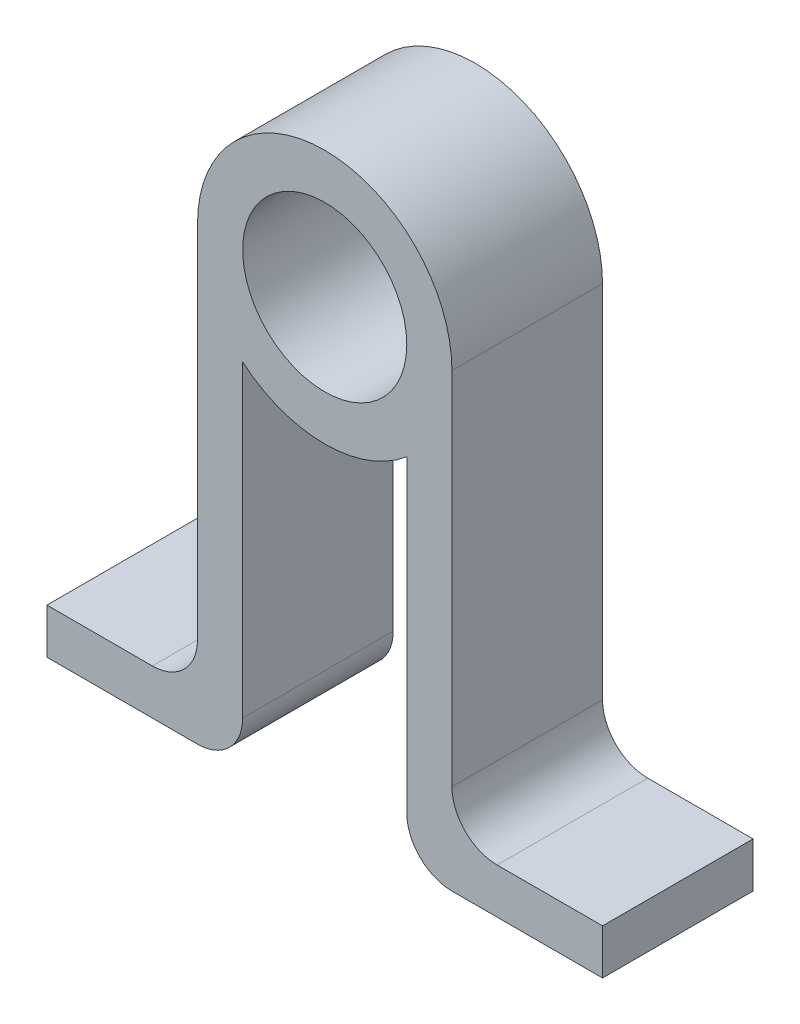
ISO-10303-21;
HEADER;
FILE_DESCRIPTION(('STEP AP214'),'2;1');
FILE_NAME('part.step','',(''),(''),'','','');
FILE_SCHEMA(('AUTOMOTIVE_DESIGN { 1 0 10303 214 1 1 1 1 }'));
ENDSEC;
DATA;
#1=APPLICATION_CONTEXT('core data for automotive mechanical design processes');
#2=APPLICATION_PROTOCOL_DEFINITION('international standard','automotive_design',2000,#1);
#3=PRODUCT_CONTEXT('',#1,'mechanical');
#4=PRODUCT('Part','Part','',(#3));
#5=PRODUCT_RELATED_PRODUCT_CATEGORY('part','',(#4));
#6=PRODUCT_DEFINITION_FORMATION('','',#4);
#7=PRODUCT_DEFINITION_CONTEXT('part definition',#1,'design');
#8=PRODUCT_DEFINITION('design','',#6,#7);
#9=PRODUCT_DEFINITION_SHAPE('','',#8);
#10=(LENGTH_UNIT() NAMED_UNIT(*) SI_UNIT(.MILLI.,.METRE.));
#11=(NAMED_UNIT(*) PLANE_ANGLE_UNIT() SI_UNIT($,.RADIAN.));
#12=(NAMED_UNIT(*) SI_UNIT($,.STERADIAN.) SOLID_ANGLE_UNIT());
#13=UNCERTAINTY_MEASURE_WITH_UNIT(LENGTH_MEASURE(1.E-05),#10,'distance_accuracy_value','');
#14=(GEOMETRIC_REPRESENTATION_CONTEXT(3) GLOBAL_UNCERTAINTY_ASSIGNED_CONTEXT((#13)) GLOBAL_UNIT_ASSIGNED_CONTEXT((#10,
#11,#12)) REPRESENTATION_CONTEXT('',''));
#15=CARTESIAN_POINT('',(0.,0.,0.));
#16=DIRECTION('',(0.,0.,1.));
#17=DIRECTION('',(1.,0.,0.));
#18=AXIS2_PLACEMENT_3D('',#15,#16,#17);
#19=CARTESIAN_POINT('',(-11.45,-23.94,10.));
#20=DIRECTION('',(0.,0.,-1.));
#21=DIRECTION('',(-1.,0.,0.));
#22=AXIS2_PLACEMENT_3D('',#19,#20,#21);
#23=CYLINDRICAL_SURFACE('',#22,3.);
#24=CARTESIAN_POINT('',(-11.45,-23.94,0.));
#25=DIRECTION('',(0.,0.,1.));
#26=DIRECTION('',(1.,0.,0.));
#27=AXIS2_PLACEMENT_3D('',#24,#25,#26);
#28=CIRCLE('',#27,3.);
#29=CARTESIAN_POINT('',(-11.45,-26.94,0.));
#30=VERTEX_POINT('',#29);
#31=CARTESIAN_POINT('',(-8.45,-23.94,0.));
#32=VERTEX_POINT('',#31);
#33=EDGE_CURVE('E205',#30,#32,#28,.T.);
#34=ORIENTED_EDGE('',*,*,#33,.F.);
#35=DIRECTION('',(0.,0.,-1.));
#36=VECTOR('',#35,1.);
#37=CARTESIAN_POINT('',(-11.45,-26.94,10.));
#38=LINE('',#37,#36);
#39=CARTESIAN_POINT('',(-11.45,-26.94,10.));
#40=VERTEX_POINT('',#39);
#41=EDGE_CURVE('E11',#40,#30,#38,.T.);
#42=ORIENTED_EDGE('',*,*,#41,.F.);
#43=CARTESIAN_POINT('',(-11.45,-23.94,10.));
#44=DIRECTION('',(0.,0.,1.));
#45=DIRECTION('',(1.,0.,0.));
#46=AXIS2_PLACEMENT_3D('',#43,#44,#45);
#47=CIRCLE('',#46,3.);
#48=CARTESIAN_POINT('',(-8.45,-23.94,10.));
#49=VERTEX_POINT('',#48);
#50=EDGE_CURVE('E257',#40,#49,#47,.T.);
#51=ORIENTED_EDGE('',*,*,#50,.T.);
#52=DIRECTION('',(0.,0.,-1.));
#53=VECTOR('',#52,1.);
#54=CARTESIAN_POINT('',(-8.45,-23.94,10.));
#55=LINE('',#54,#53);
#56=EDGE_CURVE('E125',#49,#32,#55,.T.);
#57=ORIENTED_EDGE('',*,*,#56,.T.);
#58=EDGE_LOOP('',(#34,#42,#51,#57));
#59=FACE_BOUND('',#58,.T.);
#60=ADVANCED_FACE('F50',(#59),#23,.F.);
#61=CARTESIAN_POINT('',(0.,-26.94,10.));
#62=DIRECTION('',(0.,-1.,0.));
#63=DIRECTION('',(0.,0.,-1.));
#64=AXIS2_PLACEMENT_3D('',#61,#62,#63);
#65=PLANE('',#64);
#66=DIRECTION('',(-1.,0.,0.));
#67=VECTOR('',#66,1.);
#68=CARTESIAN_POINT('',(0.,-26.94,0.));
#69=LINE('',#68,#67);
#70=CARTESIAN_POINT('',(-18.45,-26.94,0.));
#71=VERTEX_POINT('',#70);
#72=EDGE_CURVE('E206',#30,#71,#69,.T.);
#73=ORIENTED_EDGE('',*,*,#72,.T.);
#74=DIRECTION('',(0.,0.,-1.));
#75=VECTOR('',#74,1.);
#76=CARTESIAN_POINT('',(-18.45,-26.94,10.));
#77=LINE('',#76,#75);
#78=CARTESIAN_POINT('',(-18.45,-26.94,10.));
#79=VERTEX_POINT('',#78);
#80=EDGE_CURVE('E57',#79,#71,#77,.T.);
#81=ORIENTED_EDGE('',*,*,#80,.F.);
#82=DIRECTION('',(-1.,0.,0.));
#83=VECTOR('',#82,1.);
#84=CARTESIAN_POINT('',(0.,-26.94,10.));
#85=LINE('',#84,#83);
#86=EDGE_CURVE('E328',#40,#79,#85,.T.);
#87=ORIENTED_EDGE('',*,*,#86,.F.);
#88=ORIENTED_EDGE('',*,*,#41,.T.);
#89=EDGE_LOOP('',(#73,#81,#87,#88));
#90=FACE_BOUND('',#89,.T.);
#91=ADVANCED_FACE('F373',(#90),#65,.F.);
#92=CARTESIAN_POINT('',(-18.45,0.,10.));
#93=DIRECTION('',(1.,0.,0.));
#94=DIRECTION('',(0.,0.,-1.));
#95=AXIS2_PLACEMENT_3D('',#92,#93,#94);
#96=PLANE('',#95);
#97=DIRECTION('',(0.,-1.,0.));
#98=VECTOR('',#97,1.);
#99=CARTESIAN_POINT('',(-18.45,0.,0.));
#100=LINE('',#99,#98);
#101=CARTESIAN_POINT('',(-18.45,-29.94,0.));
#102=VERTEX_POINT('',#101);
#103=EDGE_CURVE('E207',#71,#102,#100,.T.);
#104=ORIENTED_EDGE('',*,*,#103,.T.);
#105=DIRECTION('',(0.,0.,-1.));
#106=VECTOR('',#105,1.);
#107=CARTESIAN_POINT('',(-18.45,-29.94,10.));
#108=LINE('',#107,#106);
#109=CARTESIAN_POINT('',(-18.45,-29.94,10.));
#110=VERTEX_POINT('',#109);
#111=EDGE_CURVE('E293',#110,#102,#108,.T.);
#112=ORIENTED_EDGE('',*,*,#111,.F.);
#113=DIRECTION('',(0.,-1.,0.));
#114=VECTOR('',#113,1.);
#115=CARTESIAN_POINT('',(-18.45,0.,10.));
#116=LINE('',#115,#114);
#117=EDGE_CURVE('E308',#79,#110,#116,.T.);
#118=ORIENTED_EDGE('',*,*,#117,.F.);
#119=ORIENTED_EDGE('',*,*,#80,.T.);
#120=EDGE_LOOP('',(#104,#112,#118,#119));
#121=FACE_BOUND('',#120,.T.);
#122=ADVANCED_FACE('F301',(#121),#96,.F.);
#123=CARTESIAN_POINT('',(0.,-29.94,10.));
#124=DIRECTION('',(0.,1.,0.));
#125=DIRECTION('',(0.,0.,1.));
#126=AXIS2_PLACEMENT_3D('',#123,#124,#125);
#127=PLANE('',#126);
#128=DIRECTION('',(1.,0.,0.));
#129=VECTOR('',#128,1.);
#130=CARTESIAN_POINT('',(0.,-29.94,0.));
#131=LINE('',#130,#129);
#132=CARTESIAN_POINT('',(-8.45,-29.94,0.));
#133=VERTEX_POINT('',#132);
#134=EDGE_CURVE('E215',#102,#133,#131,.T.);
#135=ORIENTED_EDGE('',*,*,#134,.T.);
#136=DIRECTION('',(0.,0.,-1.));
#137=VECTOR('',#136,1.);
#138=CARTESIAN_POINT('',(-8.45,-29.94,10.));
#139=LINE('',#138,#137);
#140=CARTESIAN_POINT('',(-8.45,-29.94,10.));
#141=VERTEX_POINT('',#140);
#142=EDGE_CURVE('E295',#141,#133,#139,.T.);
#143=ORIENTED_EDGE('',*,*,#142,.F.);
#144=DIRECTION('',(1.,0.,0.));
#145=VECTOR('',#144,1.);
#146=CARTESIAN_POINT('',(0.,-29.94,10.));
#147=LINE('',#146,#145);
#148=EDGE_CURVE('E319',#110,#141,#147,.T.);
#149=ORIENTED_EDGE('',*,*,#148,.F.);
#150=ORIENTED_EDGE('',*,*,#111,.T.);
#151=EDGE_LOOP('',(#135,#143,#149,#150));
#152=FACE_BOUND('',#151,.T.);
#153=ADVANCED_FACE('F320',(#152),#127,.F.);
#154=CARTESIAN_POINT('',(-8.45,-26.94,10.));
#155=DIRECTION('',(0.,0.,-1.));
#156=DIRECTION('',(-1.,0.,0.));
#157=AXIS2_PLACEMENT_3D('',#154,#155,#156);
#158=CYLINDRICAL_SURFACE('',#157,3.);
#159=CARTESIAN_POINT('',(-8.45,-26.94,0.));
#160=DIRECTION('',(0.,0.,1.));
#161=DIRECTION('',(1.,0.,0.));
#162=AXIS2_PLACEMENT_3D('',#159,#160,#161);
#163=CIRCLE('',#162,3.);
#164=CARTESIAN_POINT('',(-5.45,-26.94,0.));
#165=VERTEX_POINT('',#164);
#166=EDGE_CURVE('E216',#165,#133,#163,.F.);
#167=ORIENTED_EDGE('',*,*,#166,.F.);
#168=DIRECTION('',(0.,0.,-1.));
#169=VECTOR('',#168,1.);
#170=CARTESIAN_POINT('',(-5.45,-26.94,10.));
#171=LINE('',#170,#169);
#172=CARTESIAN_POINT('',(-5.45,-26.94,10.));
#173=VERTEX_POINT('',#172);
#174=EDGE_CURVE('E286',#173,#165,#171,.T.);
#175=ORIENTED_EDGE('',*,*,#174,.F.);
#176=CARTESIAN_POINT('',(-8.45,-26.94,10.));
#177=DIRECTION('',(0.,0.,1.));
#178=DIRECTION('',(1.,0.,0.));
#179=AXIS2_PLACEMENT_3D('',#176,#177,#178);
#180=CIRCLE('',#179,3.);
#181=EDGE_CURVE('E323',#173,#141,#180,.F.);
#182=ORIENTED_EDGE('',*,*,#181,.T.);
#183=ORIENTED_EDGE('',*,*,#142,.T.);
#184=EDGE_LOOP('',(#167,#175,#182,#183));
#185=FACE_BOUND('',#184,.T.);
#186=ADVANCED_FACE('F500',(#185),#158,.T.);
#187=CARTESIAN_POINT('',(-5.45,0.,10.));
#188=DIRECTION('',(-1.,0.,0.));
#189=DIRECTION('',(0.,-1.,0.));
#190=AXIS2_PLACEMENT_3D('',#187,#188,#189);
#191=PLANE('',#190);
#192=DIRECTION('',(0.,1.,0.));
#193=VECTOR('',#192,1.);
#194=CARTESIAN_POINT('',(-5.45,0.,0.));
#195=LINE('',#194,#193);
#196=CARTESIAN_POINT('',(-5.45,-6.45755371638518,0.));
#197=VERTEX_POINT('',#196);
#198=EDGE_CURVE('E219',#165,#197,#195,.T.);
#199=ORIENTED_EDGE('',*,*,#198,.T.);
#200=DIRECTION('',(0.,0.,-1.));
#201=VECTOR('',#200,1.);
#202=CARTESIAN_POINT('',(-5.45,-6.45755371638518,10.));
#203=LINE('',#202,#201);
#204=CARTESIAN_POINT('',(-5.45,-6.45755371638518,10.));
#205=VERTEX_POINT('',#204);
#206=EDGE_CURVE('E283',#205,#197,#203,.T.);
#207=ORIENTED_EDGE('',*,*,#206,.F.);
#208=DIRECTION('',(0.,1.,0.));
#209=VECTOR('',#208,1.);
#210=CARTESIAN_POINT('',(-5.45,0.,10.));
#211=LINE('',#210,#209);
#212=EDGE_CURVE('E330',#173,#205,#211,.T.);
#213=ORIENTED_EDGE('',*,*,#212,.F.);
#214=ORIENTED_EDGE('',*,*,#174,.T.);
#215=EDGE_LOOP('',(#199,#207,#213,#214));
#216=FACE_BOUND('',#215,.T.);
#217=ADVANCED_FACE('F487',(#216),#191,.F.);
#218=CARTESIAN_POINT('',(0.,0.,10.));
#219=DIRECTION('',(0.,0.,-1.));
#220=DIRECTION('',(-1.,0.,0.));
#221=AXIS2_PLACEMENT_3D('',#218,#219,#220);
#222=CYLINDRICAL_SURFACE('',#221,8.45);
#223=CARTESIAN_POINT('',(0.,0.,0.));
#224=DIRECTION('',(0.,0.,1.));
#225=DIRECTION('',(1.,0.,0.));
#226=AXIS2_PLACEMENT_3D('',#223,#224,#225);
#227=CIRCLE('',#226,8.45);
#228=CARTESIAN_POINT('',(5.45,-6.45755371638518,0.));
#229=VERTEX_POINT('',#228);
#230=EDGE_CURVE('E224',#197,#229,#227,.T.);
#231=ORIENTED_EDGE('',*,*,#230,.T.);
#232=DIRECTION('',(0.,0.,-1.));
#233=VECTOR('',#232,1.);
#234=CARTESIAN_POINT('',(5.45,-6.45755371638518,10.));
#235=LINE('',#234,#233);
#236=CARTESIAN_POINT('',(5.45,-6.45755371638518,10.));
#237=VERTEX_POINT('',#236);
#238=EDGE_CURVE('E285',#237,#229,#235,.T.);
#239=ORIENTED_EDGE('',*,*,#238,.F.);
#240=CARTESIAN_POINT('',(0.,0.,10.));
#241=DIRECTION('',(0.,0.,1.));
#242=DIRECTION('',(1.,0.,0.));
#243=AXIS2_PLACEMENT_3D('',#240,#241,#242);
#244=CIRCLE('',#243,8.45);
#245=EDGE_CURVE('E185',#205,#237,#244,.T.);
#246=ORIENTED_EDGE('',*,*,#245,.F.);
#247=ORIENTED_EDGE('',*,*,#206,.T.);
#248=EDGE_LOOP('',(#231,#239,#246,#247));
#249=FACE_BOUND('',#248,.T.);
#250=ADVANCED_FACE('F391',(#249),#222,.T.);
#251=CARTESIAN_POINT('',(5.45,0.,10.));
#252=DIRECTION('',(-1.,0.,0.));
#253=DIRECTION('',(0.,-1.,0.));
#254=AXIS2_PLACEMENT_3D('',#251,#252,#253);
#255=PLANE('',#254);
#256=DIRECTION('',(0.,1.,0.));
#257=VECTOR('',#256,1.);
#258=CARTESIAN_POINT('',(5.45,0.,0.));
#259=LINE('',#258,#257);
#260=CARTESIAN_POINT('',(5.45,-26.94,0.));
#261=VERTEX_POINT('',#260);
#262=EDGE_CURVE('E230',#261,#229,#259,.T.);
#263=ORIENTED_EDGE('',*,*,#262,.F.);
#264=DIRECTION('',(0.,0.,-1.));
#265=VECTOR('',#264,1.);
#266=CARTESIAN_POINT('',(5.45,-26.94,10.));
#267=LINE('',#266,#265);
#268=CARTESIAN_POINT('',(5.45,-26.94,10.));
#269=VERTEX_POINT('',#268);
#270=EDGE_CURVE('E276',#269,#261,#267,.T.);
#271=ORIENTED_EDGE('',*,*,#270,.F.);
#272=DIRECTION('',(0.,1.,0.));
#273=VECTOR('',#272,1.);
#274=CARTESIAN_POINT('',(5.45,0.,10.));
#275=LINE('',#274,#273);
#276=EDGE_CURVE('E337',#269,#237,#275,.T.);
#277=ORIENTED_EDGE('',*,*,#276,.T.);
#278=ORIENTED_EDGE('',*,*,#238,.T.);
#279=EDGE_LOOP('',(#263,#271,#277,#278));
#280=FACE_BOUND('',#279,.T.);
#281=ADVANCED_FACE('F472',(#280),#255,.T.);
#282=CARTESIAN_POINT('',(8.45,-26.94,10.));
#283=DIRECTION('',(0.,0.,-1.));
#284=DIRECTION('',(-1.,0.,0.));
#285=AXIS2_PLACEMENT_3D('',#282,#283,#284);
#286=CYLINDRICAL_SURFACE('',#285,3.);
#287=CARTESIAN_POINT('',(8.45,-26.94,0.));
#288=DIRECTION('',(0.,0.,1.));
#289=DIRECTION('',(1.,0.,0.));
#290=AXIS2_PLACEMENT_3D('',#287,#288,#289);
#291=CIRCLE('',#290,3.);
#292=CARTESIAN_POINT('',(8.45,-29.94,0.));
#293=VERTEX_POINT('',#292);
#294=EDGE_CURVE('E232',#261,#293,#291,.T.);
#295=ORIENTED_EDGE('',*,*,#294,.T.);
#296=DIRECTION('',(0.,0.,-1.));
#297=VECTOR('',#296,1.);
#298=CARTESIAN_POINT('',(8.45,-29.94,10.));
#299=LINE('',#298,#297);
#300=CARTESIAN_POINT('',(8.45,-29.94,10.));
#301=VERTEX_POINT('',#300);
#302=EDGE_CURVE('E277',#301,#293,#299,.T.);
#303=ORIENTED_EDGE('',*,*,#302,.F.);
#304=CARTESIAN_POINT('',(8.45,-26.94,10.));
#305=DIRECTION('',(0.,0.,1.));
#306=DIRECTION('',(1.,0.,0.));
#307=AXIS2_PLACEMENT_3D('',#304,#305,#306);
#308=CIRCLE('',#307,3.);
#309=EDGE_CURVE('E338',#269,#301,#308,.T.);
#310=ORIENTED_EDGE('',*,*,#309,.F.);
#311=ORIENTED_EDGE('',*,*,#270,.T.);
#312=EDGE_LOOP('',(#295,#303,#310,#311));
#313=FACE_BOUND('',#312,.T.);
#314=ADVANCED_FACE('F464',(#313),#286,.T.);
#315=CARTESIAN_POINT('',(0.,-29.94,10.));
#316=DIRECTION('',(0.,-1.,0.));
#317=DIRECTION('',(0.,0.,-1.));
#318=AXIS2_PLACEMENT_3D('',#315,#316,#317);
#319=PLANE('',#318);
#320=DIRECTION('',(-1.,0.,0.));
#321=VECTOR('',#320,1.);
#322=CARTESIAN_POINT('',(0.,-29.94,0.));
#323=LINE('',#322,#321);
#324=CARTESIAN_POINT('',(18.45,-29.94,0.));
#325=VERTEX_POINT('',#324);
#326=EDGE_CURVE('E233',#325,#293,#323,.T.);
#327=ORIENTED_EDGE('',*,*,#326,.F.);
#328=DIRECTION('',(0.,0.,-1.));
#329=VECTOR('',#328,1.);
#330=CARTESIAN_POINT('',(18.45,-29.94,10.));
#331=LINE('',#330,#329);
#332=CARTESIAN_POINT('',(18.45,-29.94,10.));
#333=VERTEX_POINT('',#332);
#334=EDGE_CURVE('E272',#333,#325,#331,.T.);
#335=ORIENTED_EDGE('',*,*,#334,.F.);
#336=DIRECTION('',(-1.,0.,0.));
#337=VECTOR('',#336,1.);
#338=CARTESIAN_POINT('',(0.,-29.94,10.));
#339=LINE('',#338,#337);
#340=EDGE_CURVE('E344',#333,#301,#339,.T.);
#341=ORIENTED_EDGE('',*,*,#340,.T.);
#342=ORIENTED_EDGE('',*,*,#302,.T.);
#343=EDGE_LOOP('',(#327,#335,#341,#342));
#344=FACE_BOUND('',#343,.T.);
#345=ADVANCED_FACE('F453',(#344),#319,.T.);
#346=CARTESIAN_POINT('',(18.45,0.,10.));
#347=DIRECTION('',(1.,0.,0.));
#348=DIRECTION('',(0.,0.,-1.));
#349=AXIS2_PLACEMENT_3D('',#346,#347,#348);
#350=PLANE('',#349);
#351=DIRECTION('',(0.,-1.,0.));
#352=VECTOR('',#351,1.);
#353=CARTESIAN_POINT('',(18.45,0.,0.));
#354=LINE('',#353,#352);
#355=CARTESIAN_POINT('',(18.45,-26.94,0.));
#356=VERTEX_POINT('',#355);
#357=EDGE_CURVE('E239',#356,#325,#354,.T.);
#358=ORIENTED_EDGE('',*,*,#357,.F.);
#359=DIRECTION('',(0.,0.,-1.));
#360=VECTOR('',#359,1.);
#361=CARTESIAN_POINT('',(18.45,-26.94,10.));
#362=LINE('',#361,#360);
#363=CARTESIAN_POINT('',(18.45,-26.94,10.));
#364=VERTEX_POINT('',#363);
#365=EDGE_CURVE('E269',#364,#356,#362,.T.);
#366=ORIENTED_EDGE('',*,*,#365,.F.);
#367=DIRECTION('',(0.,-1.,0.));
#368=VECTOR('',#367,1.);
#369=CARTESIAN_POINT('',(18.45,0.,10.));
#370=LINE('',#369,#368);
#371=EDGE_CURVE('E350',#364,#333,#370,.T.);
#372=ORIENTED_EDGE('',*,*,#371,.T.);
#373=ORIENTED_EDGE('',*,*,#334,.T.);
#374=EDGE_LOOP('',(#358,#366,#372,#373));
#375=FACE_BOUND('',#374,.T.);
#376=ADVANCED_FACE('F356',(#375),#350,.T.);
#377=CARTESIAN_POINT('',(0.,-26.94,10.));
#378=DIRECTION('',(0.,1.,0.));
#379=DIRECTION('',(0.,0.,1.));
#380=AXIS2_PLACEMENT_3D('',#377,#378,#379);
#381=PLANE('',#380);
#382=DIRECTION('',(1.,0.,0.));
#383=VECTOR('',#382,1.);
#384=CARTESIAN_POINT('',(0.,-26.94,0.));
#385=LINE('',#384,#383);
#386=CARTESIAN_POINT('',(11.45,-26.94,0.));
#387=VERTEX_POINT('',#386);
#388=EDGE_CURVE('E244',#387,#356,#385,.T.);
#389=ORIENTED_EDGE('',*,*,#388,.F.);
#390=DIRECTION('',(0.,0.,-1.));
#391=VECTOR('',#390,1.);
#392=CARTESIAN_POINT('',(11.45,-26.94,10.));
#393=LINE('',#392,#391);
#394=CARTESIAN_POINT('',(11.45,-26.94,10.));
#395=VERTEX_POINT('',#394);
#396=EDGE_CURVE('E270',#395,#387,#393,.T.);
#397=ORIENTED_EDGE('',*,*,#396,.F.);
#398=DIRECTION('',(1.,0.,0.));
#399=VECTOR('',#398,1.);
#400=CARTESIAN_POINT('',(0.,-26.94,10.));
#401=LINE('',#400,#399);
#402=EDGE_CURVE('E195',#395,#364,#401,.T.);
#403=ORIENTED_EDGE('',*,*,#402,.T.);
#404=ORIENTED_EDGE('',*,*,#365,.T.);
#405=EDGE_LOOP('',(#389,#397,#403,#404));
#406=FACE_BOUND('',#405,.T.);
#407=ADVANCED_FACE('F351',(#406),#381,.T.);
#408=CARTESIAN_POINT('',(11.45,-23.94,10.));
#409=DIRECTION('',(0.,0.,-1.));
#410=DIRECTION('',(-1.,0.,0.));
#411=AXIS2_PLACEMENT_3D('',#408,#409,#410);
#412=CYLINDRICAL_SURFACE('',#411,3.);
#413=CARTESIAN_POINT('',(11.45,-23.94,0.));
#414=DIRECTION('',(0.,0.,1.));
#415=DIRECTION('',(1.,0.,0.));
#416=AXIS2_PLACEMENT_3D('',#413,#414,#415);
#417=CIRCLE('',#416,3.);
#418=CARTESIAN_POINT('',(8.45,-23.94,0.));
#419=VERTEX_POINT('',#418);
#420=EDGE_CURVE('E250',#387,#419,#417,.F.);
#421=ORIENTED_EDGE('',*,*,#420,.T.);
#422=DIRECTION('',(0.,0.,-1.));
#423=VECTOR('',#422,1.);
#424=CARTESIAN_POINT('',(8.45,-23.94,10.));
#425=LINE('',#424,#423);
#426=CARTESIAN_POINT('',(8.45,-23.94,10.));
#427=VERTEX_POINT('',#426);
#428=EDGE_CURVE('E173',#427,#419,#425,.T.);
#429=ORIENTED_EDGE('',*,*,#428,.F.);
#430=CARTESIAN_POINT('',(11.45,-23.94,10.));
#431=DIRECTION('',(0.,0.,1.));
#432=DIRECTION('',(1.,0.,0.));
#433=AXIS2_PLACEMENT_3D('',#430,#431,#432);
#434=CIRCLE('',#433,3.);
#435=EDGE_CURVE('E190',#395,#427,#434,.F.);
#436=ORIENTED_EDGE('',*,*,#435,.F.);
#437=ORIENTED_EDGE('',*,*,#396,.T.);
#438=EDGE_LOOP('',(#421,#429,#436,#437));
#439=FACE_BOUND('',#438,.T.);
#440=ADVANCED_FACE('F361',(#439),#412,.F.);
#441=CARTESIAN_POINT('',(8.45,0.,10.));
#442=DIRECTION('',(1.,0.,0.));
#443=DIRECTION('',(0.,1.,0.));
#444=AXIS2_PLACEMENT_3D('',#441,#442,#443);
#445=PLANE('',#444);
#446=DIRECTION('',(0.,-1.,0.));
#447=VECTOR('',#446,1.);
#448=CARTESIAN_POINT('',(8.45,0.,0.));
#449=LINE('',#448,#447);
#450=CARTESIAN_POINT('',(8.45,0.,0.));
#451=VERTEX_POINT('',#450);
#452=EDGE_CURVE('E174',#451,#419,#449,.T.);
#453=ORIENTED_EDGE('',*,*,#452,.F.);
#454=DIRECTION('',(0.,0.,-1.));
#455=VECTOR('',#454,1.);
#456=CARTESIAN_POINT('',(8.45,0.,10.));
#457=LINE('',#456,#455);
#458=CARTESIAN_POINT('',(8.45,0.,10.));
#459=VERTEX_POINT('',#458);
#460=EDGE_CURVE('E170',#459,#451,#457,.T.);
#461=ORIENTED_EDGE('',*,*,#460,.F.);
#462=DIRECTION('',(0.,-1.,0.));
#463=VECTOR('',#462,1.);
#464=CARTESIAN_POINT('',(8.45,0.,10.));
#465=LINE('',#464,#463);
#466=EDGE_CURVE('E172',#459,#427,#465,.T.);
#467=ORIENTED_EDGE('',*,*,#466,.T.);
#468=ORIENTED_EDGE('',*,*,#428,.T.);
#469=EDGE_LOOP('',(#453,#461,#467,#468));
#470=FACE_BOUND('',#469,.T.);
#471=ADVANCED_FACE('F166',(#470),#445,.T.);
#472=CARTESIAN_POINT('',(-8.45,0.,0.));
#473=VERTEX_POINT('',#472);
#474=EDGE_CURVE('E113',#451,#473,#227,.T.);
#475=ORIENTED_EDGE('',*,*,#474,.T.);
#476=DIRECTION('',(0.,0.,-1.));
#477=VECTOR('',#476,1.);
#478=CARTESIAN_POINT('',(-8.45,0.,10.));
#479=LINE('',#478,#477);
#480=CARTESIAN_POINT('',(-8.45,0.,10.));
#481=VERTEX_POINT('',#480);
#482=EDGE_CURVE('E177',#481,#473,#479,.T.);
#483=ORIENTED_EDGE('',*,*,#482,.F.);
#484=EDGE_CURVE('E179',#459,#481,#244,.T.);
#485=ORIENTED_EDGE('',*,*,#484,.F.);
#486=ORIENTED_EDGE('',*,*,#460,.T.);
#487=EDGE_LOOP('',(#475,#483,#485,#486));
#488=FACE_BOUND('',#487,.T.);
#489=ADVANCED_FACE('F176',(#488),#222,.T.);
#490=CARTESIAN_POINT('',(-8.45,0.,10.));
#491=DIRECTION('',(1.,0.,0.));
#492=DIRECTION('',(0.,1.,0.));
#493=AXIS2_PLACEMENT_3D('',#490,#491,#492);
#494=PLANE('',#493);
#495=DIRECTION('',(0.,-1.,0.));
#496=VECTOR('',#495,1.);
#497=CARTESIAN_POINT('',(-8.45,0.,0.));
#498=LINE('',#497,#496);
#499=EDGE_CURVE('E251',#473,#32,#498,.T.);
#500=ORIENTED_EDGE('',*,*,#499,.T.);
#501=ORIENTED_EDGE('',*,*,#56,.F.);
#502=DIRECTION('',(0.,-1.,0.));
#503=VECTOR('',#502,1.);
#504=CARTESIAN_POINT('',(-8.45,0.,10.));
#505=LINE('',#504,#503);
#506=EDGE_CURVE('E61',#481,#49,#505,.T.);
#507=ORIENTED_EDGE('',*,*,#506,.F.);
#508=ORIENTED_EDGE('',*,*,#482,.T.);
#509=EDGE_LOOP('',(#500,#501,#507,#508));
#510=FACE_BOUND('',#509,.T.);
#511=ADVANCED_FACE('F377',(#510),#494,.F.);
#512=CARTESIAN_POINT('',(0.,0.,10.));
#513=DIRECTION('',(0.,0.,-1.));
#514=DIRECTION('',(-1.,0.,0.));
#515=AXIS2_PLACEMENT_3D('',#512,#513,#514);
#516=CYLINDRICAL_SURFACE('',#515,5.45);
#517=CARTESIAN_POINT('',(0.,0.,10.));
#518=DIRECTION('',(0.,0.,1.));
#519=DIRECTION('',(1.,0.,0.));
#520=AXIS2_PLACEMENT_3D('',#517,#518,#519);
#521=CIRCLE('',#520,5.45);
#522=CARTESIAN_POINT('',(5.45,0.,10.));
#523=VERTEX_POINT('',#522);
#524=EDGE_CURVE('E196',#523,#523,#521,.T.);
#525=ORIENTED_EDGE('',*,*,#524,.T.);
#526=EDGE_LOOP('',(#525));
#527=FACE_BOUND('',#526,.T.);
#528=CARTESIAN_POINT('',(0.,0.,0.));
#529=DIRECTION('',(0.,0.,1.));
#530=DIRECTION('',(1.,0.,0.));
#531=AXIS2_PLACEMENT_3D('',#528,#529,#530);
#532=CIRCLE('',#531,5.45);
#533=CARTESIAN_POINT('',(5.45,0.,0.));
#534=VERTEX_POINT('',#533);
#535=EDGE_CURVE('E258',#534,#534,#532,.T.);
#536=ORIENTED_EDGE('',*,*,#535,.F.);
#537=EDGE_LOOP('',(#536));
#538=FACE_BOUND('',#537,.T.);
#539=ADVANCED_FACE('F384',(#527,#538),#516,.F.);
#540=CARTESIAN_POINT('',(0.,0.,10.));
#541=DIRECTION('',(0.,0.,1.));
#542=DIRECTION('',(1.,0.,0.));
#543=AXIS2_PLACEMENT_3D('',#540,#541,#542);
#544=PLANE('',#543);
#545=ORIENTED_EDGE('',*,*,#50,.F.);
#546=ORIENTED_EDGE('',*,*,#86,.T.);
#547=ORIENTED_EDGE('',*,*,#117,.T.);
#548=ORIENTED_EDGE('',*,*,#148,.T.);
#549=ORIENTED_EDGE('',*,*,#181,.F.);
#550=ORIENTED_EDGE('',*,*,#212,.T.);
#551=ORIENTED_EDGE('',*,*,#245,.T.);
#552=ORIENTED_EDGE('',*,*,#276,.F.);
#553=ORIENTED_EDGE('',*,*,#309,.T.);
#554=ORIENTED_EDGE('',*,*,#340,.F.);
#555=ORIENTED_EDGE('',*,*,#371,.F.);
#556=ORIENTED_EDGE('',*,*,#402,.F.);
#557=ORIENTED_EDGE('',*,*,#435,.T.);
#558=ORIENTED_EDGE('',*,*,#466,.F.);
#559=ORIENTED_EDGE('',*,*,#484,.T.);
#560=ORIENTED_EDGE('',*,*,#506,.T.);
#561=EDGE_LOOP('',(#545,#546,#547,#548,#549,#550,#551,#552,#553,#554,#555,#556,#557,#558,#559,#560));
#562=FACE_BOUND('',#561,.T.);
#563=ORIENTED_EDGE('',*,*,#524,.F.);
#564=EDGE_LOOP('',(#563));
#565=FACE_BOUND('',#564,.T.);
#566=ADVANCED_FACE('F181',(#562,#565),#544,.T.);
#567=CARTESIAN_POINT('',(0.,0.,0.));
#568=DIRECTION('',(0.,0.,1.));
#569=DIRECTION('',(1.,0.,0.));
#570=AXIS2_PLACEMENT_3D('',#567,#568,#569);
#571=PLANE('',#570);
#572=ORIENTED_EDGE('',*,*,#33,.T.);
#573=ORIENTED_EDGE('',*,*,#499,.F.);
#574=ORIENTED_EDGE('',*,*,#474,.F.);
#575=ORIENTED_EDGE('',*,*,#452,.T.);
#576=ORIENTED_EDGE('',*,*,#420,.F.);
#577=ORIENTED_EDGE('',*,*,#388,.T.);
#578=ORIENTED_EDGE('',*,*,#357,.T.);
#579=ORIENTED_EDGE('',*,*,#326,.T.);
#580=ORIENTED_EDGE('',*,*,#294,.F.);
#581=ORIENTED_EDGE('',*,*,#262,.T.);
#582=ORIENTED_EDGE('',*,*,#230,.F.);
#583=ORIENTED_EDGE('',*,*,#198,.F.);
#584=ORIENTED_EDGE('',*,*,#166,.T.);
#585=ORIENTED_EDGE('',*,*,#134,.F.);
#586=ORIENTED_EDGE('',*,*,#103,.F.);
#587=ORIENTED_EDGE('',*,*,#72,.F.);
#588=EDGE_LOOP('',(#572,#573,#574,#575,#576,#577,#578,#579,#580,#581,#582,#583,#584,#585,#586,#587));
#589=FACE_BOUND('',#588,.T.);
#590=ORIENTED_EDGE('',*,*,#535,.T.);
#591=EDGE_LOOP('',(#590));
#592=FACE_BOUND('',#591,.T.);
#593=ADVANCED_FACE('F313',(#589,#592),#571,.F.);
#594=CLOSED_SHELL('',(#60,#91,#122,#153,#186,#217,#250,#281,#314,#345,#376,#407,#440,#471,#489,
#511,#539,#566,#593));
#595=MANIFOLD_SOLID_BREP('B2',#594);
#596=ADVANCED_BREP_SHAPE_REPRESENTATION('',(#18,#595),#14);
#597=SHAPE_DEFINITION_REPRESENTATION(#9,#596);
ENDSEC;
END-ISO-10303-21;
